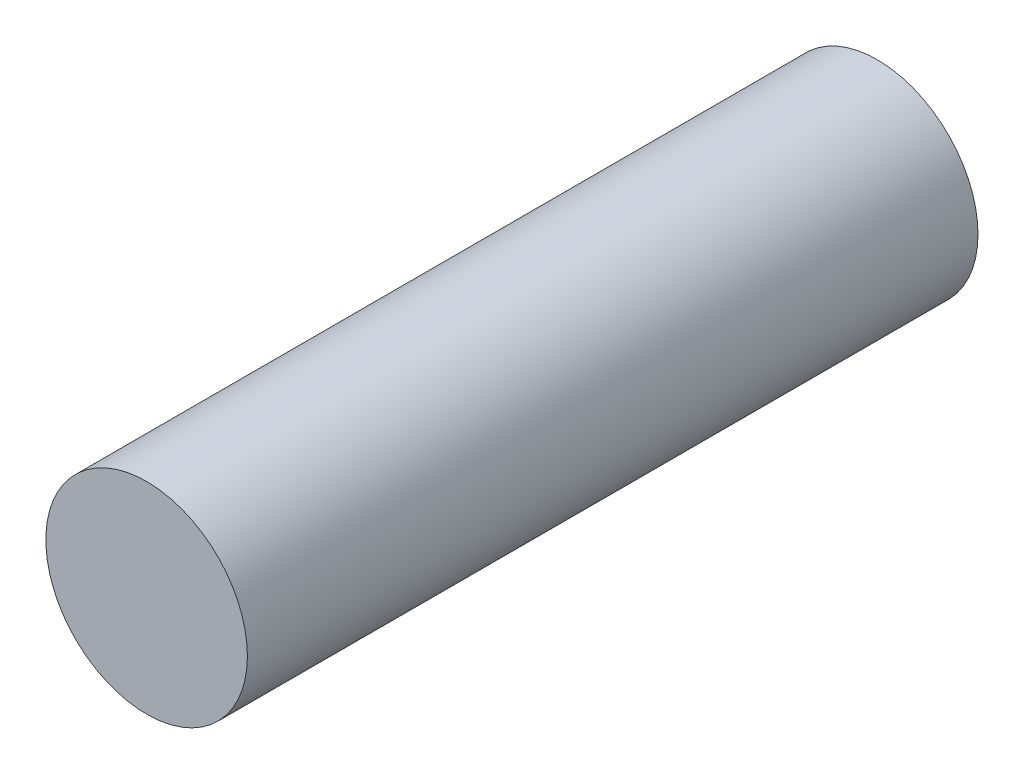
ISO-10303-21;
HEADER;
FILE_DESCRIPTION(('STEP AP214'),'2;1');
FILE_NAME('part.step','',(''),(''),'','','');
FILE_SCHEMA(('AUTOMOTIVE_DESIGN { 1 0 10303 214 1 1 1 1 }'));
ENDSEC;
DATA;
#1=APPLICATION_CONTEXT('core data for automotive mechanical design processes');
#2=APPLICATION_PROTOCOL_DEFINITION('international standard','automotive_design',2000,#1);
#3=PRODUCT_CONTEXT('',#1,'mechanical');
#4=PRODUCT('Part','Part','',(#3));
#5=PRODUCT_RELATED_PRODUCT_CATEGORY('part','',(#4));
#6=PRODUCT_DEFINITION_FORMATION('','',#4);
#7=PRODUCT_DEFINITION_CONTEXT('part definition',#1,'design');
#8=PRODUCT_DEFINITION('design','',#6,#7);
#9=PRODUCT_DEFINITION_SHAPE('','',#8);
#10=(LENGTH_UNIT() NAMED_UNIT(*) SI_UNIT(.MILLI.,.METRE.));
#11=(NAMED_UNIT(*) PLANE_ANGLE_UNIT() SI_UNIT($,.RADIAN.));
#12=(NAMED_UNIT(*) SI_UNIT($,.STERADIAN.) SOLID_ANGLE_UNIT());
#13=UNCERTAINTY_MEASURE_WITH_UNIT(LENGTH_MEASURE(1.E-05),#10,'distance_accuracy_value','');
#14=(GEOMETRIC_REPRESENTATION_CONTEXT(3) GLOBAL_UNCERTAINTY_ASSIGNED_CONTEXT((#13)) GLOBAL_UNIT_ASSIGNED_CONTEXT((#10,
#11,#12)) REPRESENTATION_CONTEXT('',''));
#15=CARTESIAN_POINT('',(0.,0.,0.));
#16=DIRECTION('',(0.,0.,1.));
#17=DIRECTION('',(1.,0.,0.));
#18=AXIS2_PLACEMENT_3D('',#15,#16,#17);
#19=CARTESIAN_POINT('',(0.,0.,29.));
#20=DIRECTION('',(0.,0.,-1.));
#21=DIRECTION('',(-1.,0.,0.));
#22=AXIS2_PLACEMENT_3D('',#19,#20,#21);
#23=CYLINDRICAL_SURFACE('',#22,4.);
#24=CARTESIAN_POINT('',(0.,0.,29.));
#25=DIRECTION('',(0.,0.,1.));
#26=DIRECTION('',(1.,0.,0.));
#27=AXIS2_PLACEMENT_3D('',#24,#25,#26);
#28=CIRCLE('',#27,4.);
#29=CARTESIAN_POINT('',(4.,0.,29.));
#30=VERTEX_POINT('',#29);
#31=EDGE_CURVE('E10',#30,#30,#28,.T.);
#32=ORIENTED_EDGE('',*,*,#31,.F.);
#33=EDGE_LOOP('',(#32));
#34=FACE_BOUND('',#33,.T.);
#35=CARTESIAN_POINT('',(0.,0.,0.));
#36=DIRECTION('',(0.,0.,1.));
#37=DIRECTION('',(1.,0.,0.));
#38=AXIS2_PLACEMENT_3D('',#35,#36,#37);
#39=CIRCLE('',#38,4.);
#40=CARTESIAN_POINT('',(4.,0.,0.));
#41=VERTEX_POINT('',#40);
#42=EDGE_CURVE('E40',#41,#41,#39,.T.);
#43=ORIENTED_EDGE('',*,*,#42,.T.);
#44=EDGE_LOOP('',(#43));
#45=FACE_BOUND('',#44,.T.);
#46=ADVANCED_FACE('F37',(#34,#45),#23,.T.);
#47=CARTESIAN_POINT('',(0.,0.,29.));
#48=DIRECTION('',(0.,0.,1.));
#49=DIRECTION('',(1.,0.,0.));
#50=AXIS2_PLACEMENT_3D('',#47,#48,#49);
#51=PLANE('',#50);
#52=ORIENTED_EDGE('',*,*,#31,.T.);
#53=EDGE_LOOP('',(#52));
#54=FACE_BOUND('',#53,.T.);
#55=ADVANCED_FACE('F52',(#54),#51,.T.);
#56=CARTESIAN_POINT('',(0.,0.,0.));
#57=DIRECTION('',(0.,0.,1.));
#58=DIRECTION('',(1.,0.,0.));
#59=AXIS2_PLACEMENT_3D('',#56,#57,#58);
#60=PLANE('',#59);
#61=ORIENTED_EDGE('',*,*,#42,.F.);
#62=EDGE_LOOP('',(#61));
#63=FACE_BOUND('',#62,.T.);
#64=ADVANCED_FACE('F50',(#63),#60,.F.);
#65=CLOSED_SHELL('',(#46,#55,#64));
#66=MANIFOLD_SOLID_BREP('B2',#65);
#67=ADVANCED_BREP_SHAPE_REPRESENTATION('',(#18,#66),#14);
#68=SHAPE_DEFINITION_REPRESENTATION(#9,#67);
ENDSEC;
END-ISO-10303-21;
